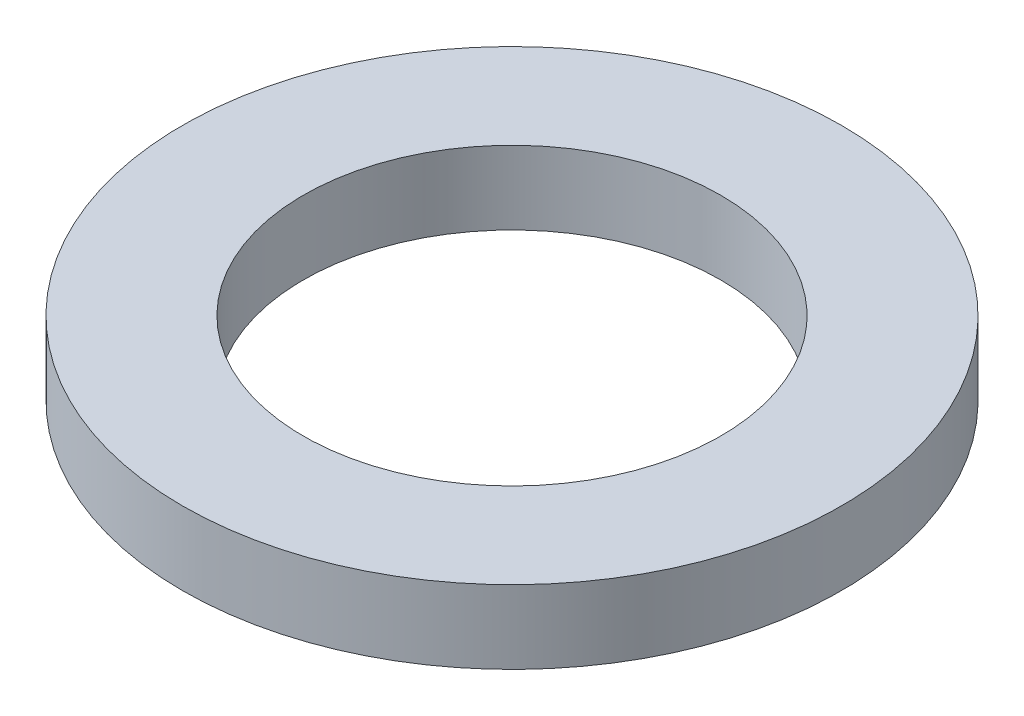
ISO-10303-21;
HEADER;
FILE_DESCRIPTION(('STEP AP214'),'2;1');
FILE_NAME('part.step','',(''),(''),'','','');
FILE_SCHEMA(('AUTOMOTIVE_DESIGN { 1 0 10303 214 1 1 1 1 }'));
ENDSEC;
DATA;
#1=APPLICATION_CONTEXT('core data for automotive mechanical design processes');
#2=APPLICATION_PROTOCOL_DEFINITION('international standard','automotive_design',2000,#1);
#3=PRODUCT_CONTEXT('',#1,'mechanical');
#4=PRODUCT('Part','Part','',(#3));
#5=PRODUCT_RELATED_PRODUCT_CATEGORY('part','',(#4));
#6=PRODUCT_DEFINITION_FORMATION('','',#4);
#7=PRODUCT_DEFINITION_CONTEXT('part definition',#1,'design');
#8=PRODUCT_DEFINITION('design','',#6,#7);
#9=PRODUCT_DEFINITION_SHAPE('','',#8);
#10=(LENGTH_UNIT() NAMED_UNIT(*) SI_UNIT(.MILLI.,.METRE.));
#11=(NAMED_UNIT(*) PLANE_ANGLE_UNIT() SI_UNIT($,.RADIAN.));
#12=(NAMED_UNIT(*) SI_UNIT($,.STERADIAN.) SOLID_ANGLE_UNIT());
#13=UNCERTAINTY_MEASURE_WITH_UNIT(LENGTH_MEASURE(1.E-05),#10,'distance_accuracy_value','');
#14=(GEOMETRIC_REPRESENTATION_CONTEXT(3) GLOBAL_UNCERTAINTY_ASSIGNED_CONTEXT((#13)) GLOBAL_UNIT_ASSIGNED_CONTEXT((#10,
#11,#12)) REPRESENTATION_CONTEXT('',''));
#15=CARTESIAN_POINT('',(0.,0.,0.));
#16=DIRECTION('',(0.,0.,1.));
#17=DIRECTION('',(1.,0.,0.));
#18=AXIS2_PLACEMENT_3D('',#15,#16,#17);
#19=CARTESIAN_POINT('',(0.,0.,0.));
#20=DIRECTION('',(0.,-1.,0.));
#21=DIRECTION('',(0.,0.,-1.));
#22=AXIS2_PLACEMENT_3D('',#19,#20,#21);
#23=CYLINDRICAL_SURFACE('',#22,22.9);
#24=CARTESIAN_POINT('',(0.,98.2962348490892,0.));
#25=DIRECTION('',(0.,-1.,0.));
#26=DIRECTION('',(0.,0.,-1.));
#27=AXIS2_PLACEMENT_3D('',#24,#25,#26);
#28=CIRCLE('',#27,22.9);
#29=CARTESIAN_POINT('',(0.,98.2962348490892,-22.9));
#30=VERTEX_POINT('',#29);
#31=EDGE_CURVE('E10',#30,#30,#28,.T.);
#32=ORIENTED_EDGE('',*,*,#31,.F.);
#33=EDGE_LOOP('',(#32));
#34=FACE_BOUND('',#33,.T.);
#35=CARTESIAN_POINT('',(0.,103.396234849089,0.));
#36=DIRECTION('',(0.,-1.,0.));
#37=DIRECTION('',(0.,0.,-1.));
#38=AXIS2_PLACEMENT_3D('',#35,#36,#37);
#39=CIRCLE('',#38,22.9);
#40=CARTESIAN_POINT('',(0.,103.396234849089,-22.9));
#41=VERTEX_POINT('',#40);
#42=EDGE_CURVE('E53',#41,#41,#39,.T.);
#43=ORIENTED_EDGE('',*,*,#42,.T.);
#44=EDGE_LOOP('',(#43));
#45=FACE_BOUND('',#44,.T.);
#46=ADVANCED_FACE('F39',(#34,#45),#23,.T.);
#47=CARTESIAN_POINT('',(0.,98.2962348490892,22.9));
#48=DIRECTION('',(0.,1.,0.));
#49=DIRECTION('',(0.,0.,1.));
#50=AXIS2_PLACEMENT_3D('',#47,#48,#49);
#51=PLANE('',#50);
#52=CARTESIAN_POINT('',(0.,98.2962348490892,0.));
#53=DIRECTION('',(0.,-1.,0.));
#54=DIRECTION('',(0.,0.,-1.));
#55=AXIS2_PLACEMENT_3D('',#52,#53,#54);
#56=CIRCLE('',#55,14.5);
#57=CARTESIAN_POINT('',(0.,98.2962348490892,-14.5));
#58=VERTEX_POINT('',#57);
#59=EDGE_CURVE('E45',#58,#58,#56,.T.);
#60=ORIENTED_EDGE('',*,*,#59,.F.);
#61=EDGE_LOOP('',(#60));
#62=FACE_BOUND('',#61,.T.);
#63=ORIENTED_EDGE('',*,*,#31,.T.);
#64=EDGE_LOOP('',(#63));
#65=FACE_BOUND('',#64,.T.);
#66=ADVANCED_FACE('F68',(#62,#65),#51,.F.);
#67=CARTESIAN_POINT('',(0.,0.,0.));
#68=DIRECTION('',(0.,-1.,0.));
#69=DIRECTION('',(0.,0.,-1.));
#70=AXIS2_PLACEMENT_3D('',#67,#68,#69);
#71=CYLINDRICAL_SURFACE('',#70,14.5);
#72=CARTESIAN_POINT('',(0.,103.396234849089,0.));
#73=DIRECTION('',(0.,-1.,0.));
#74=DIRECTION('',(0.,0.,-1.));
#75=AXIS2_PLACEMENT_3D('',#72,#73,#74);
#76=CIRCLE('',#75,14.5);
#77=CARTESIAN_POINT('',(0.,103.396234849089,-14.5));
#78=VERTEX_POINT('',#77);
#79=EDGE_CURVE('E49',#78,#78,#76,.T.);
#80=ORIENTED_EDGE('',*,*,#79,.F.);
#81=EDGE_LOOP('',(#80));
#82=FACE_BOUND('',#81,.T.);
#83=ORIENTED_EDGE('',*,*,#59,.T.);
#84=EDGE_LOOP('',(#83));
#85=FACE_BOUND('',#84,.T.);
#86=ADVANCED_FACE('F63',(#82,#85),#71,.F.);
#87=CARTESIAN_POINT('',(0.,103.396234849089,22.9));
#88=DIRECTION('',(0.,-1.,0.));
#89=DIRECTION('',(0.,0.,-1.));
#90=AXIS2_PLACEMENT_3D('',#87,#88,#89);
#91=PLANE('',#90);
#92=ORIENTED_EDGE('',*,*,#42,.F.);
#93=EDGE_LOOP('',(#92));
#94=FACE_BOUND('',#93,.T.);
#95=ORIENTED_EDGE('',*,*,#79,.T.);
#96=EDGE_LOOP('',(#95));
#97=FACE_BOUND('',#96,.T.);
#98=ADVANCED_FACE('F60',(#94,#97),#91,.F.);
#99=CLOSED_SHELL('',(#46,#66,#86,#98));
#100=MANIFOLD_SOLID_BREP('B2',#99);
#101=ADVANCED_BREP_SHAPE_REPRESENTATION('',(#18,#100),#14);
#102=SHAPE_DEFINITION_REPRESENTATION(#9,#101);
ENDSEC;
END-ISO-10303-21;
